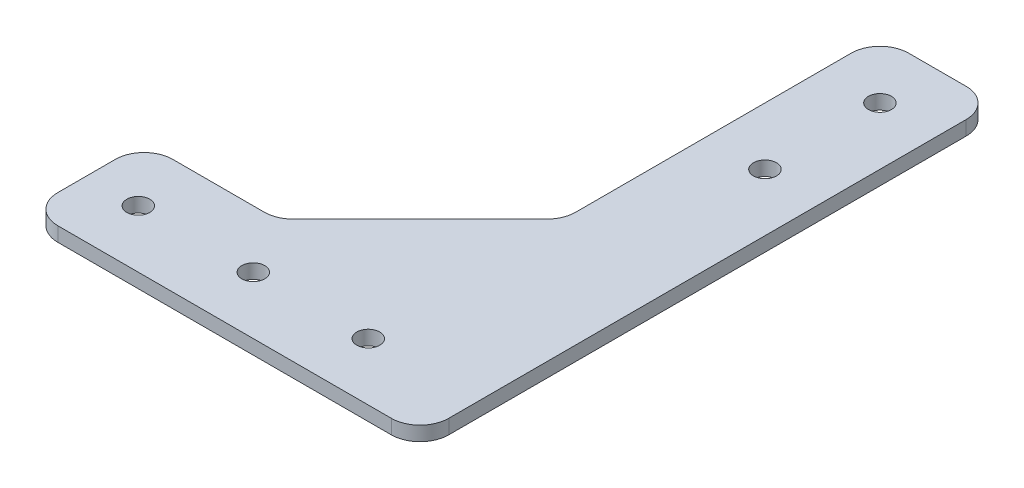
ISO-10303-21;
HEADER;
FILE_DESCRIPTION(('STEP AP214'),'2;1');
FILE_NAME('part.step','',(''),(''),'','','');
FILE_SCHEMA(('AUTOMOTIVE_DESIGN { 1 0 10303 214 1 1 1 1 }'));
ENDSEC;
DATA;
#1=APPLICATION_CONTEXT('core data for automotive mechanical design processes');
#2=APPLICATION_PROTOCOL_DEFINITION('international standard','automotive_design',2000,#1);
#3=PRODUCT_CONTEXT('',#1,'mechanical');
#4=PRODUCT('Part','Part','',(#3));
#5=PRODUCT_RELATED_PRODUCT_CATEGORY('part','',(#4));
#6=PRODUCT_DEFINITION_FORMATION('','',#4);
#7=PRODUCT_DEFINITION_CONTEXT('part definition',#1,'design');
#8=PRODUCT_DEFINITION('design','',#6,#7);
#9=PRODUCT_DEFINITION_SHAPE('','',#8);
#10=(LENGTH_UNIT() NAMED_UNIT(*) SI_UNIT(.MILLI.,.METRE.));
#11=(NAMED_UNIT(*) PLANE_ANGLE_UNIT() SI_UNIT($,.RADIAN.));
#12=(NAMED_UNIT(*) SI_UNIT($,.STERADIAN.) SOLID_ANGLE_UNIT());
#13=UNCERTAINTY_MEASURE_WITH_UNIT(LENGTH_MEASURE(1.E-05),#10,'distance_accuracy_value','');
#14=(GEOMETRIC_REPRESENTATION_CONTEXT(3) GLOBAL_UNCERTAINTY_ASSIGNED_CONTEXT((#13)) GLOBAL_UNIT_ASSIGNED_CONTEXT((#10,
#11,#12)) REPRESENTATION_CONTEXT('',''));
#15=CARTESIAN_POINT('',(0.,0.,0.));
#16=DIRECTION('',(0.,0.,1.));
#17=DIRECTION('',(1.,0.,0.));
#18=AXIS2_PLACEMENT_3D('',#15,#16,#17);
#19=CARTESIAN_POINT('',(-60.9599999999999,3.175,0.));
#20=DIRECTION('',(-1.,0.,0.));
#21=DIRECTION('',(0.,0.,1.));
#22=AXIS2_PLACEMENT_3D('',#19,#20,#21);
#23=PLANE('',#22);
#24=DIRECTION('',(0.,0.,-1.));
#25=VECTOR('',#24,1.);
#26=CARTESIAN_POINT('',(-60.9599999999999,3.175,0.));
#27=LINE('',#26,#25);
#28=CARTESIAN_POINT('',(-60.96,3.175,120.65));
#29=VERTEX_POINT('',#28);
#30=CARTESIAN_POINT('',(-60.96,3.175,107.95));
#31=VERTEX_POINT('',#30);
#32=EDGE_CURVE('E361',#29,#31,#27,.T.);
#33=ORIENTED_EDGE('',*,*,#32,.T.);
#34=DIRECTION('',(0.,-1.,0.));
#35=VECTOR('',#34,1.);
#36=CARTESIAN_POINT('',(-60.96,0.,107.95));
#37=LINE('',#36,#35);
#38=CARTESIAN_POINT('',(-60.96,0.,107.95));
#39=VERTEX_POINT('',#38);
#40=EDGE_CURVE('E232',#31,#39,#37,.T.);
#41=ORIENTED_EDGE('',*,*,#40,.T.);
#42=DIRECTION('',(0.,0.,-1.));
#43=VECTOR('',#42,1.);
#44=CARTESIAN_POINT('',(-60.9599999999999,0.,0.));
#45=LINE('',#44,#43);
#46=CARTESIAN_POINT('',(-60.96,0.,120.65));
#47=VERTEX_POINT('',#46);
#48=EDGE_CURVE('E293',#47,#39,#45,.T.);
#49=ORIENTED_EDGE('',*,*,#48,.F.);
#50=DIRECTION('',(0.,-1.,0.));
#51=VECTOR('',#50,1.);
#52=CARTESIAN_POINT('',(-60.96,3.175,120.65));
#53=LINE('',#52,#51);
#54=EDGE_CURVE('E229',#47,#29,#53,.F.);
#55=ORIENTED_EDGE('',*,*,#54,.T.);
#56=EDGE_LOOP('',(#33,#41,#49,#55));
#57=FACE_BOUND('',#56,.T.);
#58=ADVANCED_FACE('F43',(#57),#23,.T.);
#59=CARTESIAN_POINT('',(0.,3.175,127.));
#60=DIRECTION('',(0.,0.,1.));
#61=DIRECTION('',(1.,0.,0.));
#62=AXIS2_PLACEMENT_3D('',#59,#60,#61);
#63=PLANE('',#62);
#64=DIRECTION('',(-1.,0.,0.));
#65=VECTOR('',#64,1.);
#66=CARTESIAN_POINT('',(0.,0.,127.));
#67=LINE('',#66,#65);
#68=CARTESIAN_POINT('',(19.05,0.,127.));
#69=VERTEX_POINT('',#68);
#70=CARTESIAN_POINT('',(-54.61,0.,127.));
#71=VERTEX_POINT('',#70);
#72=EDGE_CURVE('E297',#69,#71,#67,.T.);
#73=ORIENTED_EDGE('',*,*,#72,.F.);
#74=DIRECTION('',(0.,-1.,0.));
#75=VECTOR('',#74,1.);
#76=CARTESIAN_POINT('',(19.05,3.175,127.));
#77=LINE('',#76,#75);
#78=CARTESIAN_POINT('',(19.05,3.175,127.));
#79=VERTEX_POINT('',#78);
#80=EDGE_CURVE('E247',#69,#79,#77,.F.);
#81=ORIENTED_EDGE('',*,*,#80,.T.);
#82=DIRECTION('',(-1.,0.,0.));
#83=VECTOR('',#82,1.);
#84=CARTESIAN_POINT('',(0.,3.175,127.));
#85=LINE('',#84,#83);
#86=CARTESIAN_POINT('',(-54.61,3.175,127.));
#87=VERTEX_POINT('',#86);
#88=EDGE_CURVE('E352',#79,#87,#85,.T.);
#89=ORIENTED_EDGE('',*,*,#88,.T.);
#90=DIRECTION('',(0.,-1.,0.));
#91=VECTOR('',#90,1.);
#92=CARTESIAN_POINT('',(-54.61,3.175,127.));
#93=LINE('',#92,#91);
#94=EDGE_CURVE('E243',#87,#71,#93,.T.);
#95=ORIENTED_EDGE('',*,*,#94,.T.);
#96=EDGE_LOOP('',(#73,#81,#89,#95));
#97=FACE_BOUND('',#96,.T.);
#98=ADVANCED_FACE('F348',(#97),#63,.T.);
#99=CARTESIAN_POINT('',(25.4,3.175,0.));
#100=DIRECTION('',(1.,0.,0.));
#101=DIRECTION('',(0.,0.,-1.));
#102=AXIS2_PLACEMENT_3D('',#99,#100,#101);
#103=PLANE('',#102);
#104=DIRECTION('',(0.,0.,1.));
#105=VECTOR('',#104,1.);
#106=CARTESIAN_POINT('',(25.4,0.,0.));
#107=LINE('',#106,#105);
#108=CARTESIAN_POINT('',(25.4,0.,6.35));
#109=VERTEX_POINT('',#108);
#110=CARTESIAN_POINT('',(25.4,0.,120.65));
#111=VERTEX_POINT('',#110);
#112=EDGE_CURVE('E301',#109,#111,#107,.T.);
#113=ORIENTED_EDGE('',*,*,#112,.F.);
#114=DIRECTION('',(0.,-1.,0.));
#115=VECTOR('',#114,1.);
#116=CARTESIAN_POINT('',(25.4,3.175,6.35));
#117=LINE('',#116,#115);
#118=CARTESIAN_POINT('',(25.4,3.175,6.35));
#119=VERTEX_POINT('',#118);
#120=EDGE_CURVE('E240',#109,#119,#117,.F.);
#121=ORIENTED_EDGE('',*,*,#120,.T.);
#122=DIRECTION('',(0.,0.,1.));
#123=VECTOR('',#122,1.);
#124=CARTESIAN_POINT('',(25.4,3.175,0.));
#125=LINE('',#124,#123);
#126=CARTESIAN_POINT('',(25.4,3.175,120.65));
#127=VERTEX_POINT('',#126);
#128=EDGE_CURVE('E341',#119,#127,#125,.T.);
#129=ORIENTED_EDGE('',*,*,#128,.T.);
#130=DIRECTION('',(0.,-1.,0.));
#131=VECTOR('',#130,1.);
#132=CARTESIAN_POINT('',(25.4,3.175,120.65));
#133=LINE('',#132,#131);
#134=EDGE_CURVE('E236',#127,#111,#133,.T.);
#135=ORIENTED_EDGE('',*,*,#134,.T.);
#136=EDGE_LOOP('',(#113,#121,#129,#135));
#137=FACE_BOUND('',#136,.T.);
#138=ADVANCED_FACE('F337',(#137),#103,.T.);
#139=CARTESIAN_POINT('',(0.,3.175,0.));
#140=DIRECTION('',(0.,0.,-1.));
#141=DIRECTION('',(-1.,0.,0.));
#142=AXIS2_PLACEMENT_3D('',#139,#140,#141);
#143=PLANE('',#142);
#144=DIRECTION('',(1.,0.,0.));
#145=VECTOR('',#144,1.);
#146=CARTESIAN_POINT('',(0.,0.,0.));
#147=LINE('',#146,#145);
#148=CARTESIAN_POINT('',(6.35,0.,0.));
#149=VERTEX_POINT('',#148);
#150=CARTESIAN_POINT('',(19.05,0.,0.));
#151=VERTEX_POINT('',#150);
#152=EDGE_CURVE('E170',#149,#151,#147,.T.);
#153=ORIENTED_EDGE('',*,*,#152,.F.);
#154=DIRECTION('',(0.,-1.,0.));
#155=VECTOR('',#154,1.);
#156=CARTESIAN_POINT('',(6.35,3.175,0.));
#157=LINE('',#156,#155);
#158=CARTESIAN_POINT('',(6.35,3.175,0.));
#159=VERTEX_POINT('',#158);
#160=EDGE_CURVE('E205',#149,#159,#157,.F.);
#161=ORIENTED_EDGE('',*,*,#160,.T.);
#162=DIRECTION('',(1.,0.,0.));
#163=VECTOR('',#162,1.);
#164=CARTESIAN_POINT('',(0.,3.175,0.));
#165=LINE('',#164,#163);
#166=CARTESIAN_POINT('',(19.05,3.175,0.));
#167=VERTEX_POINT('',#166);
#168=EDGE_CURVE('E274',#159,#167,#165,.T.);
#169=ORIENTED_EDGE('',*,*,#168,.T.);
#170=DIRECTION('',(0.,-1.,0.));
#171=VECTOR('',#170,1.);
#172=CARTESIAN_POINT('',(19.05,3.175,0.));
#173=LINE('',#172,#171);
#174=EDGE_CURVE('E201',#167,#151,#173,.T.);
#175=ORIENTED_EDGE('',*,*,#174,.T.);
#176=EDGE_LOOP('',(#153,#161,#169,#175));
#177=FACE_BOUND('',#176,.T.);
#178=ADVANCED_FACE('F328',(#177),#143,.T.);
#179=CARTESIAN_POINT('',(0.,3.175,0.));
#180=DIRECTION('',(-1.,0.,0.));
#181=DIRECTION('',(0.,0.,1.));
#182=AXIS2_PLACEMENT_3D('',#179,#180,#181);
#183=PLANE('',#182);
#184=DIRECTION('',(0.,0.,-1.));
#185=VECTOR('',#184,1.);
#186=CARTESIAN_POINT('',(0.,0.,0.));
#187=LINE('',#186,#185);
#188=CARTESIAN_POINT('',(0.,0.,67.2197438789309));
#189=VERTEX_POINT('',#188);
#190=CARTESIAN_POINT('',(0.,0.,6.35));
#191=VERTEX_POINT('',#190);
#192=EDGE_CURVE('E150',#189,#191,#187,.T.);
#193=ORIENTED_EDGE('',*,*,#192,.F.);
#194=DIRECTION('',(0.,1.,0.));
#195=VECTOR('',#194,1.);
#196=CARTESIAN_POINT('',(0.,3.175,67.2197438789309));
#197=LINE('',#196,#195);
#198=CARTESIAN_POINT('',(0.,3.175,67.2197438789309));
#199=VERTEX_POINT('',#198);
#200=EDGE_CURVE('E164',#189,#199,#197,.T.);
#201=ORIENTED_EDGE('',*,*,#200,.T.);
#202=DIRECTION('',(0.,0.,-1.));
#203=VECTOR('',#202,1.);
#204=CARTESIAN_POINT('',(0.,3.175,0.));
#205=LINE('',#204,#203);
#206=CARTESIAN_POINT('',(0.,3.175,6.35));
#207=VERTEX_POINT('',#206);
#208=EDGE_CURVE('E268',#199,#207,#205,.T.);
#209=ORIENTED_EDGE('',*,*,#208,.T.);
#210=DIRECTION('',(0.,-1.,0.));
#211=VECTOR('',#210,1.);
#212=CARTESIAN_POINT('',(0.,3.175,6.35));
#213=LINE('',#212,#211);
#214=EDGE_CURVE('E167',#207,#191,#213,.T.);
#215=ORIENTED_EDGE('',*,*,#214,.T.);
#216=EDGE_LOOP('',(#193,#201,#209,#215));
#217=FACE_BOUND('',#216,.T.);
#218=ADVANCED_FACE('F162',(#217),#183,.T.);
#219=CARTESIAN_POINT('',(12.7,3.175,38.1));
#220=DIRECTION('',(0.,-1.,0.));
#221=DIRECTION('',(0.,0.,-1.));
#222=AXIS2_PLACEMENT_3D('',#219,#220,#221);
#223=CYLINDRICAL_SURFACE('',#222,2.54);
#224=CARTESIAN_POINT('',(12.7,3.175,38.1));
#225=DIRECTION('',(0.,1.,0.));
#226=DIRECTION('',(0.,0.,1.));
#227=AXIS2_PLACEMENT_3D('',#224,#225,#226);
#228=CIRCLE('',#227,2.54);
#229=CARTESIAN_POINT('',(12.7,3.175,40.64));
#230=VERTEX_POINT('',#229);
#231=EDGE_CURVE('E267',#230,#230,#228,.T.);
#232=ORIENTED_EDGE('',*,*,#231,.T.);
#233=EDGE_LOOP('',(#232));
#234=FACE_BOUND('',#233,.T.);
#235=CARTESIAN_POINT('',(12.7,0.,38.1));
#236=DIRECTION('',(0.,1.,0.));
#237=DIRECTION('',(0.,0.,1.));
#238=AXIS2_PLACEMENT_3D('',#235,#236,#237);
#239=CIRCLE('',#238,2.54);
#240=CARTESIAN_POINT('',(12.7,0.,40.64));
#241=VERTEX_POINT('',#240);
#242=EDGE_CURVE('E310',#241,#241,#239,.T.);
#243=ORIENTED_EDGE('',*,*,#242,.F.);
#244=EDGE_LOOP('',(#243));
#245=FACE_BOUND('',#244,.T.);
#246=ADVANCED_FACE('F505',(#234,#245),#223,.F.);
#247=CARTESIAN_POINT('',(0.,3.175,101.6));
#248=DIRECTION('',(0.,0.,1.));
#249=DIRECTION('',(1.,0.,0.));
#250=AXIS2_PLACEMENT_3D('',#247,#248,#249);
#251=PLANE('',#250);
#252=DIRECTION('',(-1.,0.,0.));
#253=VECTOR('',#252,1.);
#254=CARTESIAN_POINT('',(0.,3.175,101.6));
#255=LINE('',#254,#253);
#256=CARTESIAN_POINT('',(-34.3802561210693,3.175,101.6));
#257=VERTEX_POINT('',#256);
#258=CARTESIAN_POINT('',(-54.61,3.175,101.6));
#259=VERTEX_POINT('',#258);
#260=EDGE_CURVE('E264',#257,#259,#255,.T.);
#261=ORIENTED_EDGE('',*,*,#260,.F.);
#262=DIRECTION('',(0.,-1.,0.));
#263=VECTOR('',#262,1.);
#264=CARTESIAN_POINT('',(-34.3802561210693,0.,101.6));
#265=LINE('',#264,#263);
#266=CARTESIAN_POINT('',(-34.3802561210693,0.,101.6));
#267=VERTEX_POINT('',#266);
#268=EDGE_CURVE('E225',#257,#267,#265,.T.);
#269=ORIENTED_EDGE('',*,*,#268,.T.);
#270=DIRECTION('',(-1.,0.,0.));
#271=VECTOR('',#270,1.);
#272=CARTESIAN_POINT('',(0.,0.,101.6));
#273=LINE('',#272,#271);
#274=CARTESIAN_POINT('',(-54.61,0.,101.6));
#275=VERTEX_POINT('',#274);
#276=EDGE_CURVE('E169',#267,#275,#273,.T.);
#277=ORIENTED_EDGE('',*,*,#276,.T.);
#278=DIRECTION('',(0.,-1.,0.));
#279=VECTOR('',#278,1.);
#280=CARTESIAN_POINT('',(-54.61,3.175,101.6));
#281=LINE('',#280,#279);
#282=EDGE_CURVE('E59',#275,#259,#281,.F.);
#283=ORIENTED_EDGE('',*,*,#282,.T.);
#284=EDGE_LOOP('',(#261,#269,#277,#283));
#285=FACE_BOUND('',#284,.T.);
#286=ADVANCED_FACE('F263',(#285),#251,.F.);
#287=CARTESIAN_POINT('',(-49.5299999999967,3.175,114.300000000008));
#288=DIRECTION('',(0.,-1.,0.));
#289=DIRECTION('',(0.,0.,-1.));
#290=AXIS2_PLACEMENT_3D('',#287,#288,#289);
#291=CYLINDRICAL_SURFACE('',#290,2.54);
#292=CARTESIAN_POINT('',(-49.5299999999967,3.175,114.300000000008));
#293=DIRECTION('',(0.,1.,0.));
#294=DIRECTION('',(0.,0.,1.));
#295=AXIS2_PLACEMENT_3D('',#292,#293,#294);
#296=CIRCLE('',#295,2.54);
#297=CARTESIAN_POINT('',(-49.5299999999967,3.175,116.840000000008));
#298=VERTEX_POINT('',#297);
#299=EDGE_CURVE('E365',#298,#298,#296,.T.);
#300=ORIENTED_EDGE('',*,*,#299,.T.);
#301=EDGE_LOOP('',(#300));
#302=FACE_BOUND('',#301,.T.);
#303=CARTESIAN_POINT('',(-49.5299999999967,0.,114.300000000008));
#304=DIRECTION('',(0.,1.,0.));
#305=DIRECTION('',(0.,0.,1.));
#306=AXIS2_PLACEMENT_3D('',#303,#304,#305);
#307=CIRCLE('',#306,2.54);
#308=CARTESIAN_POINT('',(-49.5299999999967,0.,116.840000000008));
#309=VERTEX_POINT('',#308);
#310=EDGE_CURVE('E289',#309,#309,#307,.T.);
#311=ORIENTED_EDGE('',*,*,#310,.F.);
#312=EDGE_LOOP('',(#311));
#313=FACE_BOUND('',#312,.T.);
#314=ADVANCED_FACE('F395',(#302,#313),#291,.F.);
#315=CARTESIAN_POINT('',(-24.1299999999967,3.175,114.300000000008));
#316=DIRECTION('',(0.,-1.,0.));
#317=DIRECTION('',(0.,0.,-1.));
#318=AXIS2_PLACEMENT_3D('',#315,#316,#317);
#319=CYLINDRICAL_SURFACE('',#318,2.54);
#320=CARTESIAN_POINT('',(-24.1299999999967,3.175,114.300000000008));
#321=DIRECTION('',(0.,1.,0.));
#322=DIRECTION('',(0.,0.,1.));
#323=AXIS2_PLACEMENT_3D('',#320,#321,#322);
#324=CIRCLE('',#323,2.54);
#325=CARTESIAN_POINT('',(-24.1299999999967,3.175,116.840000000008));
#326=VERTEX_POINT('',#325);
#327=EDGE_CURVE('E371',#326,#326,#324,.T.);
#328=ORIENTED_EDGE('',*,*,#327,.T.);
#329=EDGE_LOOP('',(#328));
#330=FACE_BOUND('',#329,.T.);
#331=CARTESIAN_POINT('',(-24.1299999999967,0.,114.300000000008));
#332=DIRECTION('',(0.,1.,0.));
#333=DIRECTION('',(0.,0.,1.));
#334=AXIS2_PLACEMENT_3D('',#331,#332,#333);
#335=CIRCLE('',#334,2.54);
#336=CARTESIAN_POINT('',(-24.1299999999967,0.,116.840000000008));
#337=VERTEX_POINT('',#336);
#338=EDGE_CURVE('E285',#337,#337,#335,.T.);
#339=ORIENTED_EDGE('',*,*,#338,.F.);
#340=EDGE_LOOP('',(#339));
#341=FACE_BOUND('',#340,.T.);
#342=ADVANCED_FACE('F398',(#330,#341),#319,.F.);
#343=CARTESIAN_POINT('',(1.27000000000325,3.175,114.300000000008));
#344=DIRECTION('',(0.,-1.,0.));
#345=DIRECTION('',(0.,0.,-1.));
#346=AXIS2_PLACEMENT_3D('',#343,#344,#345);
#347=CYLINDRICAL_SURFACE('',#346,2.54);
#348=CARTESIAN_POINT('',(1.27000000000325,3.175,114.300000000008));
#349=DIRECTION('',(0.,1.,0.));
#350=DIRECTION('',(0.,0.,1.));
#351=AXIS2_PLACEMENT_3D('',#348,#349,#350);
#352=CIRCLE('',#351,2.54);
#353=CARTESIAN_POINT('',(1.27000000000325,3.175,116.840000000008));
#354=VERTEX_POINT('',#353);
#355=EDGE_CURVE('E317',#354,#354,#352,.T.);
#356=ORIENTED_EDGE('',*,*,#355,.T.);
#357=EDGE_LOOP('',(#356));
#358=FACE_BOUND('',#357,.T.);
#359=CARTESIAN_POINT('',(1.27000000000325,0.,114.300000000008));
#360=DIRECTION('',(0.,1.,0.));
#361=DIRECTION('',(0.,0.,1.));
#362=AXIS2_PLACEMENT_3D('',#359,#360,#361);
#363=CIRCLE('',#362,2.54);
#364=CARTESIAN_POINT('',(1.27000000000325,0.,116.840000000008));
#365=VERTEX_POINT('',#364);
#366=EDGE_CURVE('E281',#365,#365,#363,.T.);
#367=ORIENTED_EDGE('',*,*,#366,.F.);
#368=EDGE_LOOP('',(#367));
#369=FACE_BOUND('',#368,.T.);
#370=ADVANCED_FACE('F384',(#358,#369),#347,.F.);
#371=CARTESIAN_POINT('',(12.7,3.175,12.7));
#372=DIRECTION('',(0.,-1.,0.));
#373=DIRECTION('',(0.,0.,-1.));
#374=AXIS2_PLACEMENT_3D('',#371,#372,#373);
#375=CYLINDRICAL_SURFACE('',#374,2.54);
#376=CARTESIAN_POINT('',(12.7,3.175,12.7));
#377=DIRECTION('',(0.,1.,0.));
#378=DIRECTION('',(0.,0.,1.));
#379=AXIS2_PLACEMENT_3D('',#376,#377,#378);
#380=CIRCLE('',#379,2.54);
#381=CARTESIAN_POINT('',(12.7,3.175,15.24));
#382=VERTEX_POINT('',#381);
#383=EDGE_CURVE('E260',#382,#382,#380,.T.);
#384=ORIENTED_EDGE('',*,*,#383,.T.);
#385=EDGE_LOOP('',(#384));
#386=FACE_BOUND('',#385,.T.);
#387=CARTESIAN_POINT('',(12.7,0.,12.7));
#388=DIRECTION('',(0.,1.,0.));
#389=DIRECTION('',(0.,0.,1.));
#390=AXIS2_PLACEMENT_3D('',#387,#388,#389);
#391=CIRCLE('',#390,2.54);
#392=CARTESIAN_POINT('',(12.7,0.,15.24));
#393=VERTEX_POINT('',#392);
#394=EDGE_CURVE('E314',#393,#393,#391,.T.);
#395=ORIENTED_EDGE('',*,*,#394,.F.);
#396=EDGE_LOOP('',(#395));
#397=FACE_BOUND('',#396,.T.);
#398=ADVANCED_FACE('F389',(#386,#397),#375,.F.);
#399=CARTESIAN_POINT('',(0.,3.175,0.));
#400=DIRECTION('',(0.,1.,0.));
#401=DIRECTION('',(0.,0.,1.));
#402=AXIS2_PLACEMENT_3D('',#399,#400,#401);
#403=PLANE('',#402);
#404=ORIENTED_EDGE('',*,*,#355,.F.);
#405=EDGE_LOOP('',(#404));
#406=FACE_BOUND('',#405,.T.);
#407=ORIENTED_EDGE('',*,*,#327,.F.);
#408=EDGE_LOOP('',(#407));
#409=FACE_BOUND('',#408,.T.);
#410=ORIENTED_EDGE('',*,*,#299,.F.);
#411=EDGE_LOOP('',(#410));
#412=FACE_BOUND('',#411,.T.);
#413=ORIENTED_EDGE('',*,*,#168,.F.);
#414=CARTESIAN_POINT('',(6.35,3.175,6.35));
#415=DIRECTION('',(0.,1.,0.));
#416=DIRECTION('',(0.,0.,1.));
#417=AXIS2_PLACEMENT_3D('',#414,#415,#416);
#418=CIRCLE('',#417,6.35);
#419=EDGE_CURVE('E220',#159,#207,#418,.T.);
#420=ORIENTED_EDGE('',*,*,#419,.T.);
#421=ORIENTED_EDGE('',*,*,#208,.F.);
#422=CARTESIAN_POINT('',(-6.34999999999999,3.175,67.2197438789309));
#423=DIRECTION('',(0.,1.,0.));
#424=DIRECTION('',(0.,0.,1.));
#425=AXIS2_PLACEMENT_3D('',#422,#423,#424);
#426=CIRCLE('',#425,6.35);
#427=CARTESIAN_POINT('',(-1.85987193946545,3.175,71.7098719394655));
#428=VERTEX_POINT('',#427);
#429=EDGE_CURVE('E157',#199,#428,#426,.F.);
#430=ORIENTED_EDGE('',*,*,#429,.T.);
#431=DIRECTION('',(-0.707106781186551,0.,0.707106781186544));
#432=VECTOR('',#431,1.);
#433=CARTESIAN_POINT('',(-31.7500000000002,3.175,101.6));
#434=LINE('',#433,#432);
#435=CARTESIAN_POINT('',(-29.8901280605348,3.175,99.7401280605346));
#436=VERTEX_POINT('',#435);
#437=EDGE_CURVE('E180',#428,#436,#434,.T.);
#438=ORIENTED_EDGE('',*,*,#437,.T.);
#439=CARTESIAN_POINT('',(-34.3802561210693,3.175,95.25));
#440=DIRECTION('',(0.,1.,0.));
#441=DIRECTION('',(0.,0.,1.));
#442=AXIS2_PLACEMENT_3D('',#439,#440,#441);
#443=CIRCLE('',#442,6.35);
#444=EDGE_CURVE('E11',#436,#257,#443,.F.);
#445=ORIENTED_EDGE('',*,*,#444,.T.);
#446=ORIENTED_EDGE('',*,*,#260,.T.);
#447=CARTESIAN_POINT('',(-54.61,3.175,107.95));
#448=DIRECTION('',(0.,1.,0.));
#449=DIRECTION('',(0.,0.,1.));
#450=AXIS2_PLACEMENT_3D('',#447,#448,#449);
#451=CIRCLE('',#450,6.35);
#452=EDGE_CURVE('E217',#259,#31,#451,.T.);
#453=ORIENTED_EDGE('',*,*,#452,.T.);
#454=ORIENTED_EDGE('',*,*,#32,.F.);
#455=CARTESIAN_POINT('',(-54.61,3.175,120.65));
#456=DIRECTION('',(0.,1.,0.));
#457=DIRECTION('',(0.,0.,1.));
#458=AXIS2_PLACEMENT_3D('',#455,#456,#457);
#459=CIRCLE('',#458,6.35);
#460=EDGE_CURVE('E208',#29,#87,#459,.T.);
#461=ORIENTED_EDGE('',*,*,#460,.T.);
#462=ORIENTED_EDGE('',*,*,#88,.F.);
#463=CARTESIAN_POINT('',(19.05,3.175,120.65));
#464=DIRECTION('',(0.,1.,0.));
#465=DIRECTION('',(0.,0.,1.));
#466=AXIS2_PLACEMENT_3D('',#463,#464,#465);
#467=CIRCLE('',#466,6.35);
#468=EDGE_CURVE('E211',#79,#127,#467,.T.);
#469=ORIENTED_EDGE('',*,*,#468,.T.);
#470=ORIENTED_EDGE('',*,*,#128,.F.);
#471=CARTESIAN_POINT('',(19.05,3.175,6.35));
#472=DIRECTION('',(0.,1.,0.));
#473=DIRECTION('',(0.,0.,1.));
#474=AXIS2_PLACEMENT_3D('',#471,#472,#473);
#475=CIRCLE('',#474,6.35);
#476=EDGE_CURVE('E214',#119,#167,#475,.T.);
#477=ORIENTED_EDGE('',*,*,#476,.T.);
#478=EDGE_LOOP('',(#413,#420,#421,#430,#438,#445,#446,#453,#454,#461,#462,#469,#470,#477));
#479=FACE_BOUND('',#478,.T.);
#480=ORIENTED_EDGE('',*,*,#231,.F.);
#481=EDGE_LOOP('',(#480));
#482=FACE_BOUND('',#481,.T.);
#483=ORIENTED_EDGE('',*,*,#383,.F.);
#484=EDGE_LOOP('',(#483));
#485=FACE_BOUND('',#484,.T.);
#486=ADVANCED_FACE('F320',(#406,#409,#412,#479,#482,#485),#403,.T.);
#487=CARTESIAN_POINT('',(0.,0.,0.));
#488=DIRECTION('',(0.,1.,0.));
#489=DIRECTION('',(0.,0.,1.));
#490=AXIS2_PLACEMENT_3D('',#487,#488,#489);
#491=PLANE('',#490);
#492=ORIENTED_EDGE('',*,*,#366,.T.);
#493=EDGE_LOOP('',(#492));
#494=FACE_BOUND('',#493,.T.);
#495=ORIENTED_EDGE('',*,*,#338,.T.);
#496=EDGE_LOOP('',(#495));
#497=FACE_BOUND('',#496,.T.);
#498=ORIENTED_EDGE('',*,*,#310,.T.);
#499=EDGE_LOOP('',(#498));
#500=FACE_BOUND('',#499,.T.);
#501=ORIENTED_EDGE('',*,*,#192,.T.);
#502=CARTESIAN_POINT('',(6.35,0.,6.35));
#503=DIRECTION('',(0.,1.,0.));
#504=DIRECTION('',(0.,0.,1.));
#505=AXIS2_PLACEMENT_3D('',#502,#503,#504);
#506=CIRCLE('',#505,6.35);
#507=EDGE_CURVE('E198',#191,#149,#506,.F.);
#508=ORIENTED_EDGE('',*,*,#507,.T.);
#509=ORIENTED_EDGE('',*,*,#152,.T.);
#510=CARTESIAN_POINT('',(19.05,0.,6.35));
#511=DIRECTION('',(0.,1.,0.));
#512=DIRECTION('',(0.,0.,1.));
#513=AXIS2_PLACEMENT_3D('',#510,#511,#512);
#514=CIRCLE('',#513,6.35);
#515=EDGE_CURVE('E192',#151,#109,#514,.F.);
#516=ORIENTED_EDGE('',*,*,#515,.T.);
#517=ORIENTED_EDGE('',*,*,#112,.T.);
#518=CARTESIAN_POINT('',(19.05,0.,120.65));
#519=DIRECTION('',(0.,1.,0.));
#520=DIRECTION('',(0.,0.,1.));
#521=AXIS2_PLACEMENT_3D('',#518,#519,#520);
#522=CIRCLE('',#521,6.35);
#523=EDGE_CURVE('E189',#111,#69,#522,.F.);
#524=ORIENTED_EDGE('',*,*,#523,.T.);
#525=ORIENTED_EDGE('',*,*,#72,.T.);
#526=CARTESIAN_POINT('',(-54.61,0.,120.65));
#527=DIRECTION('',(0.,1.,0.));
#528=DIRECTION('',(0.,0.,1.));
#529=AXIS2_PLACEMENT_3D('',#526,#527,#528);
#530=CIRCLE('',#529,6.35);
#531=EDGE_CURVE('E186',#71,#47,#530,.F.);
#532=ORIENTED_EDGE('',*,*,#531,.T.);
#533=ORIENTED_EDGE('',*,*,#48,.T.);
#534=CARTESIAN_POINT('',(-54.61,0.,107.95));
#535=DIRECTION('',(0.,1.,0.));
#536=DIRECTION('',(0.,0.,1.));
#537=AXIS2_PLACEMENT_3D('',#534,#535,#536);
#538=CIRCLE('',#537,6.35);
#539=EDGE_CURVE('E195',#39,#275,#538,.F.);
#540=ORIENTED_EDGE('',*,*,#539,.T.);
#541=ORIENTED_EDGE('',*,*,#276,.F.);
#542=CARTESIAN_POINT('',(-34.3802561210693,0.,95.25));
#543=DIRECTION('',(0.,1.,0.));
#544=DIRECTION('',(0.,0.,1.));
#545=AXIS2_PLACEMENT_3D('',#542,#543,#544);
#546=CIRCLE('',#545,6.35);
#547=CARTESIAN_POINT('',(-29.8901280605348,0.,99.7401280605346));
#548=VERTEX_POINT('',#547);
#549=EDGE_CURVE('E52',#267,#548,#546,.T.);
#550=ORIENTED_EDGE('',*,*,#549,.T.);
#551=DIRECTION('',(0.707106781186551,0.,-0.707106781186544));
#552=VECTOR('',#551,1.);
#553=CARTESIAN_POINT('',(34.9250000000001,0.,34.9250000000004));
#554=LINE('',#553,#552);
#555=CARTESIAN_POINT('',(-1.85987193946545,0.,71.7098719394655));
#556=VERTEX_POINT('',#555);
#557=EDGE_CURVE('E152',#548,#556,#554,.T.);
#558=ORIENTED_EDGE('',*,*,#557,.T.);
#559=CARTESIAN_POINT('',(-6.34999999999999,0.,67.2197438789309));
#560=DIRECTION('',(0.,1.,0.));
#561=DIRECTION('',(0.,0.,1.));
#562=AXIS2_PLACEMENT_3D('',#559,#560,#561);
#563=CIRCLE('',#562,6.35);
#564=EDGE_CURVE('E146',#556,#189,#563,.T.);
#565=ORIENTED_EDGE('',*,*,#564,.T.);
#566=EDGE_LOOP('',(#501,#508,#509,#516,#517,#524,#525,#532,#533,#540,#541,#550,#558,#565));
#567=FACE_BOUND('',#566,.T.);
#568=ORIENTED_EDGE('',*,*,#242,.T.);
#569=EDGE_LOOP('',(#568));
#570=FACE_BOUND('',#569,.T.);
#571=ORIENTED_EDGE('',*,*,#394,.T.);
#572=EDGE_LOOP('',(#571));
#573=FACE_BOUND('',#572,.T.);
#574=ADVANCED_FACE('F148',(#494,#497,#500,#567,#570,#573),#491,.F.);
#575=CARTESIAN_POINT('',(-31.7500000000002,3.175,101.6));
#576=DIRECTION('',(0.707106781186544,0.,0.707106781186551));
#577=DIRECTION('',(0.,-1.,0.));
#578=AXIS2_PLACEMENT_3D('',#575,#576,#577);
#579=PLANE('',#578);
#580=ORIENTED_EDGE('',*,*,#437,.F.);
#581=DIRECTION('',(0.,1.,0.));
#582=VECTOR('',#581,1.);
#583=CARTESIAN_POINT('',(-1.85987193946545,3.175,71.7098719394655));
#584=LINE('',#583,#582);
#585=EDGE_CURVE('E178',#428,#556,#584,.F.);
#586=ORIENTED_EDGE('',*,*,#585,.T.);
#587=ORIENTED_EDGE('',*,*,#557,.F.);
#588=DIRECTION('',(0.,-1.,0.));
#589=VECTOR('',#588,1.);
#590=CARTESIAN_POINT('',(-29.8901280605348,3.175,99.7401280605346));
#591=LINE('',#590,#589);
#592=EDGE_CURVE('E174',#548,#436,#591,.F.);
#593=ORIENTED_EDGE('',*,*,#592,.T.);
#594=EDGE_LOOP('',(#580,#586,#587,#593));
#595=FACE_BOUND('',#594,.T.);
#596=ADVANCED_FACE('F258',(#595),#579,.F.);
#597=CARTESIAN_POINT('',(-6.34999999999999,3.175,67.2197438789309));
#598=DIRECTION('',(0.,1.,0.));
#599=DIRECTION('',(0.,0.,1.));
#600=AXIS2_PLACEMENT_3D('',#597,#598,#599);
#601=CYLINDRICAL_SURFACE('',#600,6.35);
#602=ORIENTED_EDGE('',*,*,#564,.F.);
#603=ORIENTED_EDGE('',*,*,#585,.F.);
#604=ORIENTED_EDGE('',*,*,#429,.F.);
#605=ORIENTED_EDGE('',*,*,#200,.F.);
#606=EDGE_LOOP('',(#602,#603,#604,#605));
#607=FACE_BOUND('',#606,.T.);
#608=ADVANCED_FACE('F172',(#607),#601,.F.);
#609=CARTESIAN_POINT('',(6.35,3.175,6.35));
#610=DIRECTION('',(0.,-1.,0.));
#611=DIRECTION('',(0.,0.,-1.));
#612=AXIS2_PLACEMENT_3D('',#609,#610,#611);
#613=CYLINDRICAL_SURFACE('',#612,6.35);
#614=ORIENTED_EDGE('',*,*,#419,.F.);
#615=ORIENTED_EDGE('',*,*,#160,.F.);
#616=ORIENTED_EDGE('',*,*,#507,.F.);
#617=ORIENTED_EDGE('',*,*,#214,.F.);
#618=EDGE_LOOP('',(#614,#615,#616,#617));
#619=FACE_BOUND('',#618,.T.);
#620=ADVANCED_FACE('F324',(#619),#613,.T.);
#621=CARTESIAN_POINT('',(-34.3802561210693,3.175,95.25));
#622=DIRECTION('',(0.,1.,0.));
#623=DIRECTION('',(0.,0.,1.));
#624=AXIS2_PLACEMENT_3D('',#621,#622,#623);
#625=CYLINDRICAL_SURFACE('',#624,6.35);
#626=ORIENTED_EDGE('',*,*,#444,.F.);
#627=ORIENTED_EDGE('',*,*,#592,.F.);
#628=ORIENTED_EDGE('',*,*,#549,.F.);
#629=ORIENTED_EDGE('',*,*,#268,.F.);
#630=EDGE_LOOP('',(#626,#627,#628,#629));
#631=FACE_BOUND('',#630,.T.);
#632=ADVANCED_FACE('F262',(#631),#625,.F.);
#633=CARTESIAN_POINT('',(-54.61,3.175,107.95));
#634=DIRECTION('',(0.,1.,0.));
#635=DIRECTION('',(0.,0.,1.));
#636=AXIS2_PLACEMENT_3D('',#633,#634,#635);
#637=CYLINDRICAL_SURFACE('',#636,6.35);
#638=ORIENTED_EDGE('',*,*,#452,.F.);
#639=ORIENTED_EDGE('',*,*,#282,.F.);
#640=ORIENTED_EDGE('',*,*,#539,.F.);
#641=ORIENTED_EDGE('',*,*,#40,.F.);
#642=EDGE_LOOP('',(#638,#639,#640,#641));
#643=FACE_BOUND('',#642,.T.);
#644=ADVANCED_FACE('F363',(#643),#637,.T.);
#645=CARTESIAN_POINT('',(19.05,3.175,6.35));
#646=DIRECTION('',(0.,-1.,0.));
#647=DIRECTION('',(0.,0.,-1.));
#648=AXIS2_PLACEMENT_3D('',#645,#646,#647);
#649=CYLINDRICAL_SURFACE('',#648,6.35);
#650=ORIENTED_EDGE('',*,*,#476,.F.);
#651=ORIENTED_EDGE('',*,*,#120,.F.);
#652=ORIENTED_EDGE('',*,*,#515,.F.);
#653=ORIENTED_EDGE('',*,*,#174,.F.);
#654=EDGE_LOOP('',(#650,#651,#652,#653));
#655=FACE_BOUND('',#654,.T.);
#656=ADVANCED_FACE('F333',(#655),#649,.T.);
#657=CARTESIAN_POINT('',(19.05,3.175,120.65));
#658=DIRECTION('',(0.,-1.,0.));
#659=DIRECTION('',(0.,0.,-1.));
#660=AXIS2_PLACEMENT_3D('',#657,#658,#659);
#661=CYLINDRICAL_SURFACE('',#660,6.35);
#662=ORIENTED_EDGE('',*,*,#468,.F.);
#663=ORIENTED_EDGE('',*,*,#80,.F.);
#664=ORIENTED_EDGE('',*,*,#523,.F.);
#665=ORIENTED_EDGE('',*,*,#134,.F.);
#666=EDGE_LOOP('',(#662,#663,#664,#665));
#667=FACE_BOUND('',#666,.T.);
#668=ADVANCED_FACE('F344',(#667),#661,.T.);
#669=CARTESIAN_POINT('',(-54.61,3.175,120.65));
#670=DIRECTION('',(0.,-1.,0.));
#671=DIRECTION('',(0.,0.,-1.));
#672=AXIS2_PLACEMENT_3D('',#669,#670,#671);
#673=CYLINDRICAL_SURFACE('',#672,6.35);
#674=ORIENTED_EDGE('',*,*,#460,.F.);
#675=ORIENTED_EDGE('',*,*,#54,.F.);
#676=ORIENTED_EDGE('',*,*,#531,.F.);
#677=ORIENTED_EDGE('',*,*,#94,.F.);
#678=EDGE_LOOP('',(#674,#675,#676,#677));
#679=FACE_BOUND('',#678,.T.);
#680=ADVANCED_FACE('F45',(#679),#673,.T.);
#681=CLOSED_SHELL('',(#58,#98,#138,#178,#218,#246,#286,#314,#342,#370,#398,#486,#574,#596,#608,
#620,#632,#644,#656,#668,#680));
#682=MANIFOLD_SOLID_BREP('B2',#681);
#683=ADVANCED_BREP_SHAPE_REPRESENTATION('',(#18,#682),#14);
#684=SHAPE_DEFINITION_REPRESENTATION(#9,#683);
ENDSEC;
END-ISO-10303-21;
